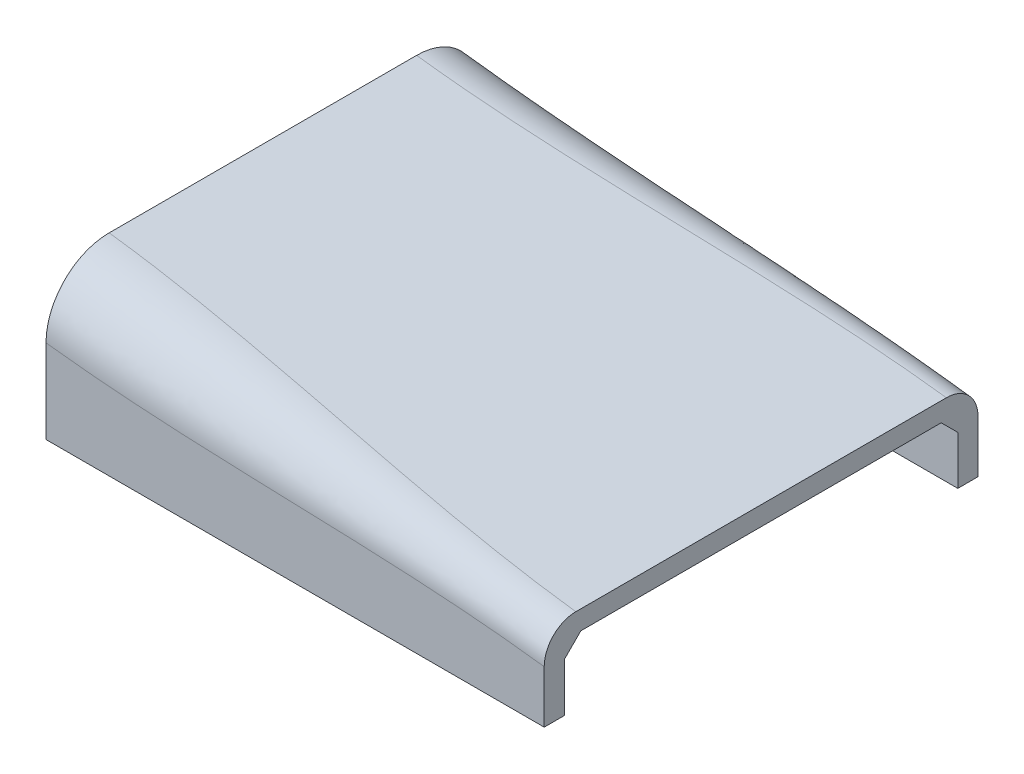
ISO-10303-21;
HEADER;
FILE_DESCRIPTION(('STEP AP214'),'2;1');
FILE_NAME('part.step','',(''),(''),'','','');
FILE_SCHEMA(('AUTOMOTIVE_DESIGN { 1 0 10303 214 1 1 1 1 }'));
ENDSEC;
DATA;
#1=APPLICATION_CONTEXT('core data for automotive mechanical design processes');
#2=APPLICATION_PROTOCOL_DEFINITION('international standard','automotive_design',2000,#1);
#3=PRODUCT_CONTEXT('',#1,'mechanical');
#4=PRODUCT('Part','Part','',(#3));
#5=PRODUCT_RELATED_PRODUCT_CATEGORY('part','',(#4));
#6=PRODUCT_DEFINITION_FORMATION('','',#4);
#7=PRODUCT_DEFINITION_CONTEXT('part definition',#1,'design');
#8=PRODUCT_DEFINITION('design','',#6,#7);
#9=PRODUCT_DEFINITION_SHAPE('','',#8);
#10=(LENGTH_UNIT() NAMED_UNIT(*) SI_UNIT(.MILLI.,.METRE.));
#11=(NAMED_UNIT(*) PLANE_ANGLE_UNIT() SI_UNIT($,.RADIAN.));
#12=(NAMED_UNIT(*) SI_UNIT($,.STERADIAN.) SOLID_ANGLE_UNIT());
#13=UNCERTAINTY_MEASURE_WITH_UNIT(LENGTH_MEASURE(1.E-05),#10,'distance_accuracy_value','');
#14=(GEOMETRIC_REPRESENTATION_CONTEXT(3) GLOBAL_UNCERTAINTY_ASSIGNED_CONTEXT((#13)) GLOBAL_UNIT_ASSIGNED_CONTEXT((#10,
#11,#12)) REPRESENTATION_CONTEXT('',''));
#15=CARTESIAN_POINT('',(0.,0.,0.));
#16=DIRECTION('',(0.,0.,1.));
#17=DIRECTION('',(1.,0.,0.));
#18=AXIS2_PLACEMENT_3D('',#15,#16,#17);
#19=CARTESIAN_POINT('',(0.,0.,261.62));
#20=DIRECTION('',(1.,0.,0.));
#21=DIRECTION('',(0.,0.,-1.));
#22=AXIS2_PLACEMENT_3D('',#19,#20,#21);
#23=PLANE('',#22);
#24=DIRECTION('',(0.,1.,0.));
#25=VECTOR('',#24,1.);
#26=CARTESIAN_POINT('',(0.,0.,249.5296));
#27=LINE('',#26,#25);
#28=CARTESIAN_POINT('',(0.,0.,249.5296));
#29=VERTEX_POINT('',#28);
#30=CARTESIAN_POINT('',(0.,29.2748351793856,249.5296));
#31=VERTEX_POINT('',#30);
#32=EDGE_CURVE('E176',#29,#31,#27,.T.);
#33=ORIENTED_EDGE('',*,*,#32,.F.);
#34=DIRECTION('',(0.,0.,-1.));
#35=VECTOR('',#34,1.);
#36=CARTESIAN_POINT('',(0.,0.,261.62));
#37=LINE('',#36,#35);
#38=CARTESIAN_POINT('',(0.,0.,261.62));
#39=VERTEX_POINT('',#38);
#40=EDGE_CURVE('E214',#39,#29,#37,.T.);
#41=ORIENTED_EDGE('',*,*,#40,.F.);
#42=DIRECTION('',(0.,-1.,0.));
#43=VECTOR('',#42,1.);
#44=CARTESIAN_POINT('',(0.,0.,261.62));
#45=LINE('',#44,#43);
#46=CARTESIAN_POINT('',(0.,50.5093577816487,261.62));
#47=VERTEX_POINT('',#46);
#48=EDGE_CURVE('E180',#47,#39,#45,.T.);
#49=ORIENTED_EDGE('',*,*,#48,.F.);
#50=CARTESIAN_POINT('',(0.,50.5093577816487,261.62));
#51=CARTESIAN_POINT('',(0.,51.2338549675014,261.620021684295));
#52=CARTESIAN_POINT('',(0.,51.9583483879421,261.599624383296));
#53=CARTESIAN_POINT('',(0.,53.405017554121,261.518160641832));
#54=CARTESIAN_POINT('',(0.,54.1271933879022,261.457095765116));
#55=CARTESIAN_POINT('',(0.,55.5669638965802,261.294466741535));
#56=CARTESIAN_POINT('',(0.,56.284558631203,261.192903123772));
#57=CARTESIAN_POINT('',(0.,57.7124950755533,260.949671154266));
#58=CARTESIAN_POINT('',(0.,58.4228406140335,260.808025243744));
#59=CARTESIAN_POINT('',(0.,59.8344788839958,260.485026201346));
#60=CARTESIAN_POINT('',(0.,60.5357717267324,260.303673557943));
#61=CARTESIAN_POINT('',(0.,61.5791148980711,260.00232622184));
#62=CARTESIAN_POINT('',(0.,61.9254584851736,259.896992394264));
#63=CARTESIAN_POINT('',(0.,62.6151222327006,259.676603558663));
#64=CARTESIAN_POINT('',(0.,62.9584416381653,259.56154619517));
#65=CARTESIAN_POINT('',(0.,64.3250333131327,259.082047980406));
#66=CARTESIAN_POINT('',(0.,65.3350786472589,258.679025524934));
#67=CARTESIAN_POINT('',(0.,67.3175076019533,257.789087703527));
#68=CARTESIAN_POINT('',(0.,68.2898914121236,257.302172760004));
#69=CARTESIAN_POINT('',(0.,69.5563144621561,256.599501051767));
#70=CARTESIAN_POINT('',(0.,69.8704473154572,256.419357720284));
#71=CARTESIAN_POINT('',(0.,70.493435895138,256.0503163317));
#72=CARTESIAN_POINT('',(0.,70.8022928587939,255.861420366901));
#73=CARTESIAN_POINT('',(0.,71.7207364445453,255.281715942071));
#74=CARTESIAN_POINT('',(0.,72.3221855375472,254.877896624369));
#75=CARTESIAN_POINT('',(0.,73.501222265985,254.036957677115));
#76=CARTESIAN_POINT('',(0.,74.0788100737197,253.599838288082));
#77=CARTESIAN_POINT('',(0.,75.4875994312902,252.469500976264));
#78=CARTESIAN_POINT('',(0.,76.3030565222708,251.756486180399));
#79=CARTESIAN_POINT('',(0.,77.870567652777,250.264002365215));
#80=CARTESIAN_POINT('',(0.,78.6226214393287,249.484533080773));
#81=CARTESIAN_POINT('',(0.,80.0580179406557,247.864396598736));
#82=CARTESIAN_POINT('',(0.,80.7413473759364,247.023717627588));
#83=CARTESIAN_POINT('',(0.,82.0340002638618,245.287295921897));
#84=CARTESIAN_POINT('',(0.,82.6433253422875,244.391554397659));
#85=CARTESIAN_POINT('',(0.,83.7793867264662,242.557907769889));
#86=CARTESIAN_POINT('',(0.,84.3066764533401,241.620345518291));
#87=CARTESIAN_POINT('',(0.,85.2799088058692,239.703822333519));
#88=CARTESIAN_POINT('',(0.,85.7258464238679,238.724858856443));
#89=CARTESIAN_POINT('',(0.,86.5327390326594,236.733224847864));
#90=CARTESIAN_POINT('',(0.,86.8937447436832,235.720574848078));
#91=CARTESIAN_POINT('',(0.,87.5283337626233,233.668418230422));
#92=CARTESIAN_POINT('',(0.,87.8019400573773,232.628918752078));
#93=CARTESIAN_POINT('',(0.,88.1752274167013,230.918031551378));
#94=CARTESIAN_POINT('',(0.,88.3018295459198,230.252390309494));
#95=CARTESIAN_POINT('',(0.,88.5191074509568,228.915281604994));
#96=CARTESIAN_POINT('',(0.,88.6097861814809,228.243814626189));
#97=CARTESIAN_POINT('',(0.,88.754825479018,226.898003092296));
#98=CARTESIAN_POINT('',(0.,88.8092404964376,226.223664388437));
#99=CARTESIAN_POINT('',(0.,88.8818411086118,224.872886597588));
#100=CARTESIAN_POINT('',(0.,88.900018493707,224.196447069412));
#101=CARTESIAN_POINT('',(0.,88.9,223.52));
#102=B_SPLINE_CURVE_WITH_KNOTS('',3,(#50,#51,#52,#53,#54,#55,#56,#57,#58,#59,#60,#61,#62,#63,
#64,#65,#66,#67,#68,#69,#70,#71,#72,#73,#74,#75,#76,#77,#78,#79,#80,#81,#82,#83,#84,#85,#86,#87,
#88,#89,#90,#91,#92,#93,#94,#95,#96,#97,#98,#99,#100,#101),.UNSPECIFIED.,.F.,.F.,(4,2,2,2,2,2,2,
2,2,2,2,2,2,2,2,2,2,2,2,2,2,2,2,2,2,4),(0.,2.17319841876267,4.34631327855721,6.51939974829448,
8.69127195231501,10.8631174393272,11.9490097830875,13.0351659360635,16.2934072809777,
19.5516322205639,20.6378889645533,21.7238873672266,23.8959191988091,26.0679353437322,
29.3134576848088,32.5589929746501,35.8051541939462,39.0512440863283,42.2743851960364,
45.4977246403848,48.7191342341981,51.9396958691884,53.9715440449321,56.0032250661097,
58.031848578687,60.0609316250404),.UNSPECIFIED.);
#103=CARTESIAN_POINT('',(0.,88.9,223.52));
#104=VERTEX_POINT('',#103);
#105=EDGE_CURVE('E232',#47,#104,#102,.T.);
#106=ORIENTED_EDGE('',*,*,#105,.T.);
#107=DIRECTION('',(0.,0.,-1.));
#108=VECTOR('',#107,1.);
#109=CARTESIAN_POINT('',(0.,88.9,261.62));
#110=LINE('',#109,#108);
#111=CARTESIAN_POINT('',(0.,88.9,38.1));
#112=VERTEX_POINT('',#111);
#113=EDGE_CURVE('E190',#104,#112,#110,.T.);
#114=ORIENTED_EDGE('',*,*,#113,.T.);
#115=CARTESIAN_POINT('',(0.,88.9,38.1));
#116=CARTESIAN_POINT('',(0.,88.9000237332035,37.3908185569623));
#117=CARTESIAN_POINT('',(0.,88.8800416192242,36.6816397971363));
#118=CARTESIAN_POINT('',(0.,88.8002387506326,35.2655722821444));
#119=CARTESIAN_POINT('',(0.,88.7404205363225,34.558683383845));
#120=CARTESIAN_POINT('',(0.,88.581120236481,33.1494047577195));
#121=CARTESIAN_POINT('',(0.,88.4816390255648,32.4470149310307));
#122=CARTESIAN_POINT('',(0.,88.2434660688437,31.0496201930839));
#123=CARTESIAN_POINT('',(0.,88.1048126301125,30.3546087519551));
#124=CARTESIAN_POINT('',(0.,87.7887126300176,28.9734698241933));
#125=CARTESIAN_POINT('',(0.,87.6112663421349,28.2873422749669));
#126=CARTESIAN_POINT('',(0.,87.2181663681753,26.9261254482831));
#127=CARTESIAN_POINT('',(0.,87.0025128802907,26.2510361135868));
#128=CARTESIAN_POINT('',(0.,86.5335240818755,24.9134870786321));
#129=CARTESIAN_POINT('',(0.,86.2801596280114,24.251037597249));
#130=CARTESIAN_POINT('',(0.,85.736700672084,22.9413714325287));
#131=CARTESIAN_POINT('',(0.,85.4466057020306,22.2941549434024));
#132=CARTESIAN_POINT('',(0.,84.830635914236,21.016979273597));
#133=CARTESIAN_POINT('',(0.,84.5047611443375,20.3870200698439));
#134=CARTESIAN_POINT('',(0.,83.8183339939151,19.1463855855002));
#135=CARTESIAN_POINT('',(0.,83.4577855887443,18.535708104887));
#136=CARTESIAN_POINT('',(0.,82.7031378998175,17.3354367013278));
#137=CARTESIAN_POINT('',(0.,82.3090386735818,16.7458427422382));
#138=CARTESIAN_POINT('',(0.,81.4885974787508,15.5895879303813));
#139=CARTESIAN_POINT('',(0.,81.062255551151,15.0229270484569));
#140=CARTESIAN_POINT('',(0.,79.9545813932788,13.6330990528378));
#141=CARTESIAN_POINT('',(0.,79.2535411269209,12.8255093116065));
#142=CARTESIAN_POINT('',(0.,77.7863565448944,11.2719446191966));
#143=CARTESIAN_POINT('',(0.,77.020211742435,10.5259701288012));
#144=CARTESIAN_POINT('',(0.,75.4280794487412,9.10049271826823));
#145=CARTESIAN_POINT('',(0.,74.602079473983,8.42100373434533));
#146=CARTESIAN_POINT('',(0.,72.8962865894875,7.13332371544002));
#147=CARTESIAN_POINT('',(0.,72.0164941775879,6.5251320207682));
#148=CARTESIAN_POINT('',(0.,70.2023427054651,5.37973061542341));
#149=CARTESIAN_POINT('',(0.,69.267615167588,4.84310446109733));
#150=CARTESIAN_POINT('',(0.,67.3564226623036,3.8500320396117));
#151=CARTESIAN_POINT('',(0.,66.379955123345,3.39359072142104));
#152=CARTESIAN_POINT('',(0.,64.3926831270967,2.56419703589597));
#153=CARTESIAN_POINT('',(0.,63.3818928731475,2.19121060693241));
#154=CARTESIAN_POINT('',(0.,61.3328126860295,1.53106451350714));
#155=CARTESIAN_POINT('',(0.,60.294528840952,1.24388601819609));
#156=CARTESIAN_POINT('',(0.,58.5302519546596,0.834385523766727));
#157=CARTESIAN_POINT('',(0.,57.8095920660374,0.688661958516971));
#158=CARTESIAN_POINT('',(0.,56.3611634159637,0.438554696652073));
#159=CARTESIAN_POINT('',(0.,55.6333956599314,0.334165237614919));
#160=CARTESIAN_POINT('',(0.,54.4172478158907,0.194985811048258));
#161=CARTESIAN_POINT('',(0.,53.9301594022672,0.14859492246495));
#162=CARTESIAN_POINT('',(0.,52.9545149839559,0.0743347082214391));
#163=CARTESIAN_POINT('',(0.,52.465958852614,0.0464670299628804));
#164=CARTESIAN_POINT('',(0.,51.488052292353,0.00929524580367477));
#165=CARTESIAN_POINT('',(0.,50.9987017355363,-5.49510605874235E-06));
#166=CARTESIAN_POINT('',(0.,50.5093577816487,0.));
#167=B_SPLINE_CURVE_WITH_KNOTS('',3,(#115,#116,#117,#118,#119,#120,#121,#122,#123,#124,#125,
#126,#127,#128,#129,#130,#131,#132,#133,#134,#135,#136,#137,#138,#139,#140,#141,#142,#143,#144,
#145,#146,#147,#148,#149,#150,#151,#152,#153,#154,#155,#156,#157,#158,#159,#160,#161,#162,#163,
#164,#165,#166),.UNSPECIFIED.,.F.,.F.,(4,2,2,2,2,2,2,2,2,2,2,2,2,2,2,2,2,2,2,2,2,2,2,2,2,4),(0.,
2.12725894675263,4.25438225364198,6.38145865757526,8.50646212109456,10.6314506042961,
12.7564280648583,14.8830563343877,17.0097117023949,19.1363642267952,21.262773219235,
23.3891785661865,25.5155812095299,28.7198454629637,31.9241336769881,35.1290921184651,
38.3340209032178,41.563664946971,44.7935082527984,48.0220309023648,51.2498445201604,
53.4545043655155,55.6588567491087,57.1264171941195,58.5941081423244,60.0620650643086),.UNSPECIFIED.);
#168=CARTESIAN_POINT('',(0.,50.5093577816487,0.));
#169=VERTEX_POINT('',#168);
#170=EDGE_CURVE('E243',#112,#169,#167,.T.);
#171=ORIENTED_EDGE('',*,*,#170,.T.);
#172=DIRECTION('',(0.,-1.,0.));
#173=VECTOR('',#172,1.);
#174=CARTESIAN_POINT('',(0.,0.,0.));
#175=LINE('',#174,#173);
#176=CARTESIAN_POINT('',(0.,0.,0.));
#177=VERTEX_POINT('',#176);
#178=EDGE_CURVE('E179',#169,#177,#175,.T.);
#179=ORIENTED_EDGE('',*,*,#178,.T.);
#180=CARTESIAN_POINT('',(0.,0.,12.192));
#181=VERTEX_POINT('',#180);
#182=EDGE_CURVE('E213',#181,#177,#37,.T.);
#183=ORIENTED_EDGE('',*,*,#182,.F.);
#184=DIRECTION('',(0.,-1.,0.));
#185=VECTOR('',#184,1.);
#186=CARTESIAN_POINT('',(0.,0.,12.192));
#187=LINE('',#186,#185);
#188=CARTESIAN_POINT('',(0.,29.2748351793856,12.192));
#189=VERTEX_POINT('',#188);
#190=EDGE_CURVE('E170',#189,#181,#187,.T.);
#191=ORIENTED_EDGE('',*,*,#190,.F.);
#192=DIRECTION('',(0.,-0.707106781186548,-0.707106781186548));
#193=VECTOR('',#192,1.);
#194=CARTESIAN_POINT('',(0.,139.351417589693,122.268582410307));
#195=LINE('',#194,#193);
#196=CARTESIAN_POINT('',(0.,39.2748351793856,22.192));
#197=VERTEX_POINT('',#196);
#198=EDGE_CURVE('E166',#197,#189,#195,.T.);
#199=ORIENTED_EDGE('',*,*,#198,.F.);
#200=DIRECTION('',(0.,0.,-1.));
#201=VECTOR('',#200,1.);
#202=CARTESIAN_POINT('',(0.,39.2748351793856,261.62));
#203=LINE('',#202,#201);
#204=CARTESIAN_POINT('',(0.,39.2748351793856,239.5296));
#205=VERTEX_POINT('',#204);
#206=EDGE_CURVE('E151',#205,#197,#203,.T.);
#207=ORIENTED_EDGE('',*,*,#206,.F.);
#208=DIRECTION('',(0.,0.707106781186547,-0.707106781186548));
#209=VECTOR('',#208,1.);
#210=CARTESIAN_POINT('',(0.,8.59221758969282,270.212217589693));
#211=LINE('',#210,#209);
#212=EDGE_CURVE('E143',#31,#205,#211,.T.);
#213=ORIENTED_EDGE('',*,*,#212,.F.);
#214=EDGE_LOOP('',(#33,#41,#49,#106,#114,#171,#179,#183,#191,#199,#207,#213));
#215=FACE_BOUND('',#214,.T.);
#216=ADVANCED_FACE('F49',(#215),#23,.F.);
#217=CARTESIAN_POINT('',(0.,0.,261.62));
#218=DIRECTION('',(0.,1.,0.));
#219=DIRECTION('',(0.,0.,1.));
#220=AXIS2_PLACEMENT_3D('',#217,#218,#219);
#221=PLANE('',#220);
#222=DIRECTION('',(-1.,0.,0.));
#223=VECTOR('',#222,1.);
#224=CARTESIAN_POINT('',(314.452,0.,249.5296));
#225=LINE('',#224,#223);
#226=CARTESIAN_POINT('',(300.482,0.,249.5296));
#227=VERTEX_POINT('',#226);
#228=EDGE_CURVE('E152',#227,#29,#225,.T.);
#229=ORIENTED_EDGE('',*,*,#228,.F.);
#230=DIRECTION('',(0.,0.,-1.));
#231=VECTOR('',#230,1.);
#232=CARTESIAN_POINT('',(300.482,0.,261.62));
#233=LINE('',#232,#231);
#234=CARTESIAN_POINT('',(300.482,0.,261.62));
#235=VERTEX_POINT('',#234);
#236=EDGE_CURVE('E209',#235,#227,#233,.T.);
#237=ORIENTED_EDGE('',*,*,#236,.F.);
#238=DIRECTION('',(1.,0.,0.));
#239=VECTOR('',#238,1.);
#240=CARTESIAN_POINT('',(0.,0.,261.62));
#241=LINE('',#240,#239);
#242=EDGE_CURVE('E183',#39,#235,#241,.T.);
#243=ORIENTED_EDGE('',*,*,#242,.F.);
#244=ORIENTED_EDGE('',*,*,#40,.T.);
#245=EDGE_LOOP('',(#229,#237,#243,#244));
#246=FACE_BOUND('',#245,.T.);
#247=ADVANCED_FACE('F252',(#246),#221,.F.);
#248=DIRECTION('',(-1.,0.,0.));
#249=VECTOR('',#248,1.);
#250=CARTESIAN_POINT('',(314.452,0.,12.192));
#251=LINE('',#250,#249);
#252=CARTESIAN_POINT('',(300.482,0.,12.192));
#253=VERTEX_POINT('',#252);
#254=EDGE_CURVE('E438',#253,#181,#251,.T.);
#255=ORIENTED_EDGE('',*,*,#254,.T.);
#256=ORIENTED_EDGE('',*,*,#182,.T.);
#257=DIRECTION('',(1.,0.,0.));
#258=VECTOR('',#257,1.);
#259=CARTESIAN_POINT('',(0.,0.,0.));
#260=LINE('',#259,#258);
#261=CARTESIAN_POINT('',(300.482,0.,0.));
#262=VERTEX_POINT('',#261);
#263=EDGE_CURVE('E194',#177,#262,#260,.T.);
#264=ORIENTED_EDGE('',*,*,#263,.T.);
#265=EDGE_CURVE('E208',#253,#262,#233,.T.);
#266=ORIENTED_EDGE('',*,*,#265,.F.);
#267=EDGE_LOOP('',(#255,#256,#264,#266));
#268=FACE_BOUND('',#267,.T.);
#269=ADVANCED_FACE('F293',(#268),#221,.F.);
#270=CARTESIAN_POINT('',(300.482,0.,261.62));
#271=DIRECTION('',(-1.,0.,0.));
#272=DIRECTION('',(0.,0.,1.));
#273=AXIS2_PLACEMENT_3D('',#270,#271,#272);
#274=PLANE('',#273);
#275=DIRECTION('',(0.,-1.,0.));
#276=VECTOR('',#275,1.);
#277=CARTESIAN_POINT('',(300.482,0.,249.5296));
#278=LINE('',#277,#276);
#279=CARTESIAN_POINT('',(300.482,29.2748351793856,249.5296));
#280=VERTEX_POINT('',#279);
#281=EDGE_CURVE('E11',#280,#227,#278,.T.);
#282=ORIENTED_EDGE('',*,*,#281,.F.);
#283=DIRECTION('',(0.,-0.707106781186547,0.707106781186548));
#284=VECTOR('',#283,1.);
#285=CARTESIAN_POINT('',(300.482,8.59221758969282,270.212217589693));
#286=LINE('',#285,#284);
#287=CARTESIAN_POINT('',(300.482,39.2748351793856,239.5296));
#288=VERTEX_POINT('',#287);
#289=EDGE_CURVE('E456',#288,#280,#286,.T.);
#290=ORIENTED_EDGE('',*,*,#289,.F.);
#291=DIRECTION('',(0.,0.,1.));
#292=VECTOR('',#291,1.);
#293=CARTESIAN_POINT('',(300.482,39.2748351793856,261.62));
#294=LINE('',#293,#292);
#295=CARTESIAN_POINT('',(300.482,39.2748351793856,22.192));
#296=VERTEX_POINT('',#295);
#297=EDGE_CURVE('E159',#296,#288,#294,.T.);
#298=ORIENTED_EDGE('',*,*,#297,.F.);
#299=DIRECTION('',(0.,0.707106781186548,0.707106781186548));
#300=VECTOR('',#299,1.);
#301=CARTESIAN_POINT('',(300.482,139.351417589693,122.268582410307));
#302=LINE('',#301,#300);
#303=CARTESIAN_POINT('',(300.482,29.2748351793856,12.192));
#304=VERTEX_POINT('',#303);
#305=EDGE_CURVE('E459',#304,#296,#302,.T.);
#306=ORIENTED_EDGE('',*,*,#305,.F.);
#307=DIRECTION('',(0.,1.,0.));
#308=VECTOR('',#307,1.);
#309=CARTESIAN_POINT('',(300.482,0.,12.192));
#310=LINE('',#309,#308);
#311=EDGE_CURVE('E62',#253,#304,#310,.T.);
#312=ORIENTED_EDGE('',*,*,#311,.F.);
#313=ORIENTED_EDGE('',*,*,#265,.T.);
#314=DIRECTION('',(0.,1.,0.));
#315=VECTOR('',#314,1.);
#316=CARTESIAN_POINT('',(300.482,0.,0.));
#317=LINE('',#316,#315);
#318=CARTESIAN_POINT('',(300.482,31.5922364821457,0.));
#319=VERTEX_POINT('',#318);
#320=EDGE_CURVE('E184',#262,#319,#317,.T.);
#321=ORIENTED_EDGE('',*,*,#320,.T.);
#322=CARTESIAN_POINT('',(300.482,31.5922364821457,0.));
#323=CARTESIAN_POINT('',(300.482,31.954409117299,-1.08906948531902E-05));
#324=CARTESIAN_POINT('',(300.482,32.316580676166,0.010164400643445));
#325=CARTESIAN_POINT('',(300.482,33.0397720518617,0.0508083251498978));
#326=CARTESIAN_POINT('',(300.482,33.4007919044421,0.0812763221027689));
#327=CARTESIAN_POINT('',(300.482,34.1205491203961,0.1624261927709));
#328=CARTESIAN_POINT('',(300.482,34.4792865091514,0.213107841304666));
#329=CARTESIAN_POINT('',(300.482,35.1931631035561,0.334496964644925));
#330=CARTESIAN_POINT('',(300.482,35.5483040880604,0.405193982415675));
#331=CARTESIAN_POINT('',(300.482,36.2540573503136,0.56641459742345));
#332=CARTESIAN_POINT('',(300.482,36.6046696910207,0.656937918716249));
#333=CARTESIAN_POINT('',(300.482,37.3002361376109,0.857528089594006));
#334=CARTESIAN_POINT('',(300.482,37.6451902760038,0.967594826847107));
#335=CARTESIAN_POINT('',(300.482,38.4994194689579,1.26688462253664));
#336=CARTESIAN_POINT('',(300.482,39.0045229758761,1.46815314859513));
#337=CARTESIAN_POINT('',(300.482,39.996011703211,1.91266886502859));
#338=CARTESIAN_POINT('',(300.482,40.4823945259945,2.15592141073041));
#339=CARTESIAN_POINT('',(300.482,41.1950922958557,2.55090625781202));
#340=CARTESIAN_POINT('',(300.482,41.4298534471124,2.68759088985279));
#341=CARTESIAN_POINT('',(300.482,41.8933113177583,2.97073740526871));
#342=CARTESIAN_POINT('',(300.482,42.1220097266016,3.11719652398882));
#343=CARTESIAN_POINT('',(300.482,42.7985211548653,3.57095534844908));
#344=CARTESIAN_POINT('',(300.482,43.2367943858733,3.8926609160772));
#345=CARTESIAN_POINT('',(300.482,44.0828651283246,4.57083784471547));
#346=CARTESIAN_POINT('',(300.482,44.4907671282743,4.92717926045942));
#347=CARTESIAN_POINT('',(300.482,45.2749293790284,5.67315869252944));
#348=CARTESIAN_POINT('',(300.482,45.6511894985601,6.06279684698032));
#349=CARTESIAN_POINT('',(300.482,46.3693357821011,6.87269143512568));
#350=CARTESIAN_POINT('',(300.482,46.71121519402,7.29295385533523));
#351=CARTESIAN_POINT('',(300.482,47.3579687314923,8.16103978064142));
#352=CARTESIAN_POINT('',(300.482,47.6628436761,8.60886267538577));
#353=CARTESIAN_POINT('',(300.482,48.2311989917099,9.52547200452256));
#354=CARTESIAN_POINT('',(300.482,48.4949683931787,9.99407923044769));
#355=CARTESIAN_POINT('',(300.482,48.9818503110772,10.9519939887277));
#356=CARTESIAN_POINT('',(300.482,49.2049603429801,11.4413027838207));
#357=CARTESIAN_POINT('',(300.482,49.6087111991708,12.4368186609585));
#358=CARTESIAN_POINT('',(300.482,49.7893772990699,12.9430154799124));
#359=CARTESIAN_POINT('',(300.482,50.1070035453185,13.9687276062505));
#360=CARTESIAN_POINT('',(300.482,50.2439751377144,14.4882393871109));
#361=CARTESIAN_POINT('',(300.482,50.5035112444139,15.6756616965805));
#362=CARTESIAN_POINT('',(300.482,50.6127415044361,16.3465642180439));
#363=CARTESIAN_POINT('',(300.482,50.7219604931707,17.3579429143746));
#364=CARTESIAN_POINT('',(300.482,50.7492623911276,17.6957054251948));
#365=CARTESIAN_POINT('',(300.482,50.785684760305,18.372286038639));
#366=CARTESIAN_POINT('',(300.482,50.7948011176608,18.7111043627472));
#367=CARTESIAN_POINT('',(300.482,50.7948035716802,19.05));
#368=B_SPLINE_CURVE_WITH_KNOTS('',3,(#322,#323,#324,#325,#326,#327,#328,#329,#330,#331,#332,
#333,#334,#335,#336,#337,#338,#339,#340,#341,#342,#343,#344,#345,#346,#347,#348,#349,#350,#351,
#352,#353,#354,#355,#356,#357,#358,#359,#360,#361,#362,#363,#364,#365,#366,#367),.UNSPECIFIED.,
.F.,.F.,(4,2,2,2,2,2,2,2,2,2,2,2,2,2,2,2,2,2,2,2,2,2,4),(0.,1.08637340515084,2.17271275201276,
3.2590399973163,4.34480073465611,5.43054636124335,6.51628574737219,8.14545610313911,
9.77483442366469,10.5895809836862,11.4040980662505,13.0329817663689,14.6559742939839,
16.2789735545829,17.9022909390546,19.5255723865841,21.1368677099936,22.7482614600368,
24.3586931693423,25.9687026690253,28.003465249707,29.0196454786372,30.036055557978),.UNSPECIFIED.);
#369=CARTESIAN_POINT('',(300.482,50.7948035716802,19.05));
#370=VERTEX_POINT('',#369);
#371=EDGE_CURVE('E272',#319,#370,#368,.T.);
#372=ORIENTED_EDGE('',*,*,#371,.T.);
#373=DIRECTION('',(0.,0.,-1.));
#374=VECTOR('',#373,1.);
#375=CARTESIAN_POINT('',(300.482,50.7948035716802,261.62));
#376=LINE('',#375,#374);
#377=CARTESIAN_POINT('',(300.482,50.7948035716802,242.57));
#378=VERTEX_POINT('',#377);
#379=EDGE_CURVE('E204',#378,#370,#376,.T.);
#380=ORIENTED_EDGE('',*,*,#379,.F.);
#381=CARTESIAN_POINT('',(300.482,50.7948035716802,242.57));
#382=CARTESIAN_POINT('',(300.482,50.7948154596895,242.925143363583));
#383=CARTESIAN_POINT('',(300.482,50.7847932340893,243.280285221188));
#384=CARTESIAN_POINT('',(300.482,50.7447674429722,243.989418730854));
#385=CARTESIAN_POINT('',(300.482,50.7147651467961,244.343410454548));
#386=CARTESIAN_POINT('',(300.482,50.6348669568373,245.049134177401));
#387=CARTESIAN_POINT('',(300.482,50.5849714989565,245.400866225903));
#388=CARTESIAN_POINT('',(300.482,50.4655154406574,246.10062064797));
#389=CARTESIAN_POINT('',(300.482,50.3959740403474,246.448646300915));
#390=CARTESIAN_POINT('',(300.482,50.2374333762479,247.140239434579));
#391=CARTESIAN_POINT('',(300.482,50.1484342551718,247.483806947978));
#392=CARTESIAN_POINT('',(300.482,49.9512824674219,248.165379523791));
#393=CARTESIAN_POINT('',(300.482,49.8431299076134,248.503384617228));
#394=CARTESIAN_POINT('',(300.482,49.5491746872008,249.340308630786));
#395=CARTESIAN_POINT('',(300.482,49.3515930212756,249.83513731473));
#396=CARTESIAN_POINT('',(300.482,48.9154803258906,250.806508942461));
#397=CARTESIAN_POINT('',(300.482,48.6769437432811,251.283049395778));
#398=CARTESIAN_POINT('',(300.482,48.2898459921374,251.981469557706));
#399=CARTESIAN_POINT('',(300.482,48.1559181937601,252.211564042468));
#400=CARTESIAN_POINT('',(300.482,47.8785666267225,252.665866712635));
#401=CARTESIAN_POINT('',(300.482,47.7351455442905,252.890076538303));
#402=CARTESIAN_POINT('',(300.482,47.2909345846786,253.553429042461));
#403=CARTESIAN_POINT('',(300.482,46.9761758912589,253.983332806946));
#404=CARTESIAN_POINT('',(300.482,46.3106951792515,254.816706887371));
#405=CARTESIAN_POINT('',(300.482,45.9598516883125,255.220079893729));
#406=CARTESIAN_POINT('',(300.482,45.2256061154745,255.996043489525));
#407=CARTESIAN_POINT('',(300.482,44.8422038211508,256.368633878094));
#408=CARTESIAN_POINT('',(300.482,44.0455237512503,257.080534746901));
#409=CARTESIAN_POINT('',(300.482,43.6322398927192,257.419838417681));
#410=CARTESIAN_POINT('',(300.482,42.7788108168102,258.062778866861));
#411=CARTESIAN_POINT('',(300.482,42.3386658437671,258.36641596962));
#412=CARTESIAN_POINT('',(300.482,41.4311511732525,258.93816835975));
#413=CARTESIAN_POINT('',(300.482,40.9635985143333,259.20599325158));
#414=CARTESIAN_POINT('',(300.482,40.0076719003143,259.701551464929));
#415=CARTESIAN_POINT('',(300.482,39.5192966620847,259.929282311321));
#416=CARTESIAN_POINT('',(300.482,38.5254229448482,260.343012402643));
#417=CARTESIAN_POINT('',(300.482,38.0199314091567,260.529028341447));
#418=CARTESIAN_POINT('',(300.482,36.9952500358553,260.858172863366));
#419=CARTESIAN_POINT('',(300.482,36.476063234861,261.001310868157));
#420=CARTESIAN_POINT('',(300.482,35.5945828213401,261.205176914468));
#421=CARTESIAN_POINT('',(300.482,35.2349542316488,261.277633897014));
#422=CARTESIAN_POINT('',(300.482,34.5121648874769,261.401989496324));
#423=CARTESIAN_POINT('',(300.482,34.1490043856868,261.453889572905));
#424=CARTESIAN_POINT('',(300.482,33.4208664221012,261.536905259228));
#425=CARTESIAN_POINT('',(300.482,33.0558924500017,261.568051552879));
#426=CARTESIAN_POINT('',(300.482,32.3246925142841,261.609606432922));
#427=CARTESIAN_POINT('',(300.482,31.9584663142414,261.620010858792));
#428=CARTESIAN_POINT('',(300.482,31.5922364821457,261.62));
#429=B_SPLINE_CURVE_WITH_KNOTS('',3,(#381,#382,#383,#384,#385,#386,#387,#388,#389,#390,#391,
#392,#393,#394,#395,#396,#397,#398,#399,#400,#401,#402,#403,#404,#405,#406,#407,#408,#409,#410,
#411,#412,#413,#414,#415,#416,#417,#418,#419,#420,#421,#422,#423,#424,#425,#426,#427,#428),
.UNSPECIFIED.,.F.,.F.,(4,2,2,2,2,2,2,2,2,2,2,2,2,2,2,2,2,2,2,2,2,2,2,4),(0.,1.06528641628581,
2.13050516101123,3.19570056578503,4.25985852818476,5.32400868573827,6.38815290613237,
7.98464477111961,9.58135327847381,10.379848009411,11.1781177555356,12.7745271077634,
14.3764981964405,15.9784797377221,17.5807883156664,19.1830823208197,20.797669134332,
22.4123555861801,24.0263946995169,25.640078895447,26.740101657721,27.8400462895807,
28.9383610531657,30.0368961007772),.UNSPECIFIED.);
#430=CARTESIAN_POINT('',(300.482,31.5922364821457,261.62));
#431=VERTEX_POINT('',#430);
#432=EDGE_CURVE('E77',#378,#431,#429,.T.);
#433=ORIENTED_EDGE('',*,*,#432,.T.);
#434=DIRECTION('',(0.,1.,0.));
#435=VECTOR('',#434,1.);
#436=CARTESIAN_POINT('',(300.482,0.,261.62));
#437=LINE('',#436,#435);
#438=EDGE_CURVE('E187',#235,#431,#437,.T.);
#439=ORIENTED_EDGE('',*,*,#438,.F.);
#440=ORIENTED_EDGE('',*,*,#236,.T.);
#441=EDGE_LOOP('',(#282,#290,#298,#306,#312,#313,#321,#372,#380,#433,#439,#440));
#442=FACE_BOUND('',#441,.T.);
#443=ADVANCED_FACE('F288',(#442),#274,.F.);
#444=CARTESIAN_POINT('',(0.,88.9,261.62));
#445=DIRECTION('',(-0.125806022646148,-0.992054859705831,0.));
#446=DIRECTION('',(0.992054859705831,-0.125806022646148,0.));
#447=AXIS2_PLACEMENT_3D('',#444,#445,#446);
#448=PLANE('',#447);
#449=ORIENTED_EDGE('',*,*,#379,.T.);
#450=CARTESIAN_POINT('',(908.63581419422,-26.3273553213741,19.05));
#451=CARTESIAN_POINT('',(716.732811039949,-1.99144957534617,19.05));
#452=CARTESIAN_POINT('',(524.829807885679,22.3444561706818,19.05));
#453=CARTESIAN_POINT('',(332.926804731409,46.6803619167098,19.05));
#454=CARTESIAN_POINT('',(322.111869820939,48.0518424683666,19.05));
#455=CARTESIAN_POINT('',(311.29693491047,49.4233230200234,19.05));
#456=CARTESIAN_POINT('',(300.482,50.7948035716802,19.05));
#457=CARTESIAN_POINT('',(200.321333333334,63.4965357144534,19.05));
#458=CARTESIAN_POINT('',(100.160666666666,76.1982678572269,38.1));
#459=CARTESIAN_POINT('',(0.,88.9,38.1));
#460=CARTESIAN_POINT('',(-10.0160666666671,90.1701732142774,38.1));
#461=CARTESIAN_POINT('',(-20.0321333333341,91.4403464285547,38.1));
#462=CARTESIAN_POINT('',(-30.0482000000011,92.7105196428321,38.1));
#463=CARTESIAN_POINT('',(-221.951203154273,117.04642538886,38.1));
#464=CARTESIAN_POINT('',(-413.854206308544,141.382331134888,38.1));
#465=CARTESIAN_POINT('',(-605.757209462816,165.718236880916,38.1));
#466=(BOUNDED_CURVE() B_SPLINE_CURVE(3,(#450,#451,#452,#453,#454,#455,#456,#457,#458,#459,#460,
#461,#462,#463,#464,#465),.UNSPECIFIED.,.F.,.F.) B_SPLINE_CURVE_WITH_KNOTS((4,3,3,3,3,4),
(-1.58608444647263,0.,0.0893857822397923,0.917216889294524,1.,2.58608444647262),
.UNSPECIFIED.) CURVE() GEOMETRIC_REPRESENTATION_ITEM() RATIONAL_B_SPLINE_CURVE((1.,1.,1.,1.,1.,
1.,1.,1.,1.,1.,1.,1.,1.,1.,1.,1.)) REPRESENTATION_ITEM(''));
#467=EDGE_CURVE('E223',#370,#112,#466,.T.);
#468=ORIENTED_EDGE('',*,*,#467,.T.);
#469=ORIENTED_EDGE('',*,*,#113,.F.);
#470=CARTESIAN_POINT('',(908.635814194219,-26.3273553213741,242.570000000001));
#471=CARTESIAN_POINT('',(716.732811039949,-1.99144957534613,242.57));
#472=CARTESIAN_POINT('',(524.829807885679,22.3444561706818,242.57));
#473=CARTESIAN_POINT('',(332.926804731409,46.6803619167098,242.57));
#474=CARTESIAN_POINT('',(322.111869820939,48.0518424683666,242.57));
#475=CARTESIAN_POINT('',(311.29693491047,49.4233230200234,242.57));
#476=CARTESIAN_POINT('',(300.482,50.7948035716802,242.57));
#477=CARTESIAN_POINT('',(200.321333333334,63.4965357144534,242.57));
#478=CARTESIAN_POINT('',(100.160666666667,76.1982678572269,223.52));
#479=CARTESIAN_POINT('',(0.,88.9,223.52));
#480=CARTESIAN_POINT('',(-10.016066666667,90.1701732142774,223.52));
#481=CARTESIAN_POINT('',(-20.032133333334,91.4403464285547,223.52));
#482=CARTESIAN_POINT('',(-30.048200000001,92.7105196428321,223.52));
#483=CARTESIAN_POINT('',(-221.951203154272,117.04642538886,223.52));
#484=CARTESIAN_POINT('',(-413.854206308544,141.382331134888,223.520000000001));
#485=CARTESIAN_POINT('',(-605.757209462815,165.718236880915,223.520000000001));
#486=(BOUNDED_CURVE() B_SPLINE_CURVE(3,(#470,#471,#472,#473,#474,#475,#476,#477,#478,#479,#480,
#481,#482,#483,#484,#485),.UNSPECIFIED.,.F.,.F.) B_SPLINE_CURVE_WITH_KNOTS((4,3,3,3,3,4),
(-1.58608444647262,0.,0.0893857822397923,0.917216889294523,1.,2.58608444647262),
.UNSPECIFIED.) CURVE() GEOMETRIC_REPRESENTATION_ITEM() RATIONAL_B_SPLINE_CURVE((1.,1.,1.,1.,1.,
1.,1.,1.,1.,1.,1.,1.,1.,1.,1.,1.)) REPRESENTATION_ITEM(''));
#487=EDGE_CURVE('E218',#104,#378,#486,.F.);
#488=ORIENTED_EDGE('',*,*,#487,.T.);
#489=EDGE_LOOP('',(#449,#468,#469,#488));
#490=FACE_BOUND('',#489,.T.);
#491=ADVANCED_FACE('F292',(#490),#448,.F.);
#492=CARTESIAN_POINT('',(0.,0.,261.62));
#493=DIRECTION('',(0.,0.,-1.));
#494=DIRECTION('',(-1.,0.,0.));
#495=AXIS2_PLACEMENT_3D('',#492,#493,#494);
#496=PLANE('',#495);
#497=ORIENTED_EDGE('',*,*,#438,.T.);
#498=CARTESIAN_POINT('',(906.23920946281,-45.2260003987702,261.620000000001));
#499=CARTESIAN_POINT('',(714.33620630854,-20.8900946527422,261.62));
#500=CARTESIAN_POINT('',(522.43320315427,3.44581109328572,261.62));
#501=CARTESIAN_POINT('',(330.5302,27.7817168393137,261.62));
#502=CARTESIAN_POINT('',(319.71526508953,29.1531973909705,261.62));
#503=CARTESIAN_POINT('',(308.900330179061,30.5246779426273,261.62));
#504=CARTESIAN_POINT('',(298.085395268591,31.8961584942841,261.62));
#505=CARTESIAN_POINT('',(197.924728601925,44.5978906370573,261.62));
#506=CARTESIAN_POINT('',(95.3674572038483,38.4009777024347,261.62));
#507=CARTESIAN_POINT('',(-4.79320946281822,51.1027098452078,261.62));
#508=CARTESIAN_POINT('',(-14.8092761294853,52.3728830594852,261.62));
#509=CARTESIAN_POINT('',(-24.8253427961523,53.6430562737626,261.62));
#510=CARTESIAN_POINT('',(-34.8414094628194,54.9132294880399,261.62));
#511=CARTESIAN_POINT('',(-226.744412617091,79.2491352340677,261.62));
#512=CARTESIAN_POINT('',(-418.647415771362,103.585040980096,261.620000000001));
#513=CARTESIAN_POINT('',(-610.550418925634,127.920946726123,261.620000000001));
#514=(BOUNDED_CURVE() B_SPLINE_CURVE(3,(#498,#499,#500,#501,#502,#503,#504,#505,#506,#507,#508,
#509,#510,#511,#512,#513),.UNSPECIFIED.,.F.,.F.) B_SPLINE_CURVE_WITH_KNOTS((4,3,3,3,3,4),
(-1.58608444647262,0.,0.0893857822397923,0.917216889294523,1.,2.58608444647262),
.UNSPECIFIED.) CURVE() GEOMETRIC_REPRESENTATION_ITEM() RATIONAL_B_SPLINE_CURVE((1.,1.,1.,1.,1.,
1.,1.,1.,1.,1.,1.,1.,1.,1.,1.,1.)) REPRESENTATION_ITEM(''));
#515=EDGE_CURVE('E280',#431,#47,#514,.T.);
#516=ORIENTED_EDGE('',*,*,#515,.T.);
#517=ORIENTED_EDGE('',*,*,#48,.T.);
#518=ORIENTED_EDGE('',*,*,#242,.T.);
#519=EDGE_LOOP('',(#497,#516,#517,#518));
#520=FACE_BOUND('',#519,.T.);
#521=ADVANCED_FACE('F297',(#520),#496,.F.);
#522=CARTESIAN_POINT('',(0.,0.,0.));
#523=DIRECTION('',(0.,0.,-1.));
#524=DIRECTION('',(-1.,0.,0.));
#525=AXIS2_PLACEMENT_3D('',#522,#523,#524);
#526=PLANE('',#525);
#527=ORIENTED_EDGE('',*,*,#178,.F.);
#528=CARTESIAN_POINT('',(906.23920946281,-45.2260003987702,0.));
#529=CARTESIAN_POINT('',(714.33620630854,-20.8900946527423,0.));
#530=CARTESIAN_POINT('',(522.43320315427,3.4458110932857,0.));
#531=CARTESIAN_POINT('',(330.5302,27.7817168393137,0.));
#532=CARTESIAN_POINT('',(319.71526508953,29.1531973909705,0.));
#533=CARTESIAN_POINT('',(308.900330179061,30.5246779426273,0.));
#534=CARTESIAN_POINT('',(298.085395268591,31.8961584942841,0.));
#535=CARTESIAN_POINT('',(197.924728601925,44.5978906370573,0.));
#536=CARTESIAN_POINT('',(95.3674572038482,38.4009777024347,0.));
#537=CARTESIAN_POINT('',(-4.79320946281833,51.1027098452078,0.));
#538=CARTESIAN_POINT('',(-14.8092761294854,52.3728830594852,0.));
#539=CARTESIAN_POINT('',(-24.8253427961524,53.6430562737626,0.));
#540=CARTESIAN_POINT('',(-34.8414094628194,54.9132294880399,0.));
#541=CARTESIAN_POINT('',(-226.744412617091,79.2491352340678,0.));
#542=CARTESIAN_POINT('',(-418.647415771363,103.585040980096,0.));
#543=CARTESIAN_POINT('',(-610.550418925634,127.920946726123,0.));
#544=(BOUNDED_CURVE() B_SPLINE_CURVE(3,(#528,#529,#530,#531,#532,#533,#534,#535,#536,#537,#538,
#539,#540,#541,#542,#543),.UNSPECIFIED.,.F.,.F.) B_SPLINE_CURVE_WITH_KNOTS((4,3,3,3,3,4),
(-1.58608444647263,0.,0.0893857822397923,0.917216889294524,1.,2.58608444647262),
.UNSPECIFIED.) CURVE() GEOMETRIC_REPRESENTATION_ITEM() RATIONAL_B_SPLINE_CURVE((1.,1.,1.,1.,1.,
1.,1.,1.,1.,1.,1.,1.,1.,1.,1.,1.)) REPRESENTATION_ITEM(''));
#545=EDGE_CURVE('E416',#169,#319,#544,.F.);
#546=ORIENTED_EDGE('',*,*,#545,.T.);
#547=ORIENTED_EDGE('',*,*,#320,.F.);
#548=ORIENTED_EDGE('',*,*,#263,.F.);
#549=EDGE_LOOP('',(#527,#546,#547,#548));
#550=FACE_BOUND('',#549,.T.);
#551=ADVANCED_FACE('F263',(#550),#526,.T.);
#552=CARTESIAN_POINT('',(365.998505957434,42.4864212765503,19.05));
#553=CARTESIAN_POINT('',(354.974605548759,43.8844014899368,19.05));
#554=CARTESIAN_POINT('',(343.950705140084,45.2823817033233,19.05));
#555=CARTESIAN_POINT('',(332.926804731409,46.6803619167098,19.05));
#556=CARTESIAN_POINT('',(322.111869820939,48.0518424683666,19.05));
#557=CARTESIAN_POINT('',(311.29693491047,49.4233230200234,19.05));
#558=CARTESIAN_POINT('',(300.482,50.7948035716802,19.05));
#559=CARTESIAN_POINT('',(200.321333333334,63.4965357144534,19.05));
#560=CARTESIAN_POINT('',(100.160666666666,76.1982678572269,38.1));
#561=CARTESIAN_POINT('',(0.,88.9,38.1));
#562=CARTESIAN_POINT('',(-10.0160666666671,90.1701732142774,38.1));
#563=CARTESIAN_POINT('',(-20.0321333333341,91.4403464285547,38.1));
#564=CARTESIAN_POINT('',(-30.0482000000011,92.7105196428321,38.1));
#565=CARTESIAN_POINT('',(-41.0721004086759,94.1084998562185,38.1));
#566=CARTESIAN_POINT('',(-52.0960008173507,95.506480069605,38.1));
#567=CARTESIAN_POINT('',(-63.1199012260255,96.9044602829914,38.1));
#568=CARTESIAN_POINT('',(365.998505957434,42.4864212765503,0.));
#569=CARTESIAN_POINT('',(354.974605548759,43.8844014899368,0.));
#570=CARTESIAN_POINT('',(343.950705140084,45.2823817033233,0.));
#571=CARTESIAN_POINT('',(332.926804731409,46.6803619167097,0.));
#572=CARTESIAN_POINT('',(322.111869820939,48.0518424683666,0.));
#573=CARTESIAN_POINT('',(311.29693491047,49.4233230200234,0.));
#574=CARTESIAN_POINT('',(300.482,50.7948035716802,0.));
#575=CARTESIAN_POINT('',(200.321333333334,63.4965357144534,0.));
#576=CARTESIAN_POINT('',(100.160666666666,76.1982678572269,0.));
#577=CARTESIAN_POINT('',(0.,88.9,0.));
#578=CARTESIAN_POINT('',(-10.0160666666671,90.1701732142774,0.));
#579=CARTESIAN_POINT('',(-20.0321333333341,91.4403464285547,0.));
#580=CARTESIAN_POINT('',(-30.0482000000011,92.7105196428321,0.));
#581=CARTESIAN_POINT('',(-41.0721004086759,94.1084998562186,0.));
#582=CARTESIAN_POINT('',(-52.0960008173507,95.506480069605,0.));
#583=CARTESIAN_POINT('',(-63.1199012260255,96.9044602829914,0.));
#584=CARTESIAN_POINT('',(363.601901226025,23.5877761991542,0.));
#585=CARTESIAN_POINT('',(352.57800081735,24.9857564125407,0.));
#586=CARTESIAN_POINT('',(341.554100408675,26.3837366259272,0.));
#587=CARTESIAN_POINT('',(330.5302,27.7817168393137,0.));
#588=CARTESIAN_POINT('',(319.71526508953,29.1531973909705,0.));
#589=CARTESIAN_POINT('',(308.900330179061,30.5246779426273,0.));
#590=CARTESIAN_POINT('',(298.085395268591,31.8961584942841,0.));
#591=CARTESIAN_POINT('',(197.924728601925,44.5978906370573,0.));
#592=CARTESIAN_POINT('',(95.3674572038482,38.4009777024347,0.));
#593=CARTESIAN_POINT('',(-4.79320946281833,51.1027098452078,0.));
#594=CARTESIAN_POINT('',(-14.8092761294854,52.3728830594852,0.));
#595=CARTESIAN_POINT('',(-24.8253427961524,53.6430562737626,0.));
#596=CARTESIAN_POINT('',(-34.8414094628194,54.9132294880399,0.));
#597=CARTESIAN_POINT('',(-45.8653098714941,56.3112097014264,0.));
#598=CARTESIAN_POINT('',(-56.8892102801689,57.7091899148128,0.));
#599=CARTESIAN_POINT('',(-67.9131106888437,59.1071701281993,0.));
#600=(BOUNDED_SURFACE() B_SPLINE_SURFACE(2,3,((#552,#553,#554,#555,#556,#557,#558,#559,#560,
#561,#562,#563,#564,#565,#566,#567),(#568,#569,#570,#571,#572,#573,#574,#575,#576,#577,#578,
#579,#580,#581,#582,#583),(#584,#585,#586,#587,#588,#589,#590,#591,#592,#593,#594,#595,#596,
#597,#598,#599)),.UNSPECIFIED.,.F.,.F.,.F.) B_SPLINE_SURFACE_WITH_KNOTS((3,3),(4,3,3,3,3,4),(0.,
1.),(-0.0911128887524841,0.,0.0893857822397923,0.917216889294524,1.,1.09111288875248),
.UNSPECIFIED.) GEOMETRIC_REPRESENTATION_ITEM() RATIONAL_B_SPLINE_SURFACE(((1.,1.,1.,1.,1.,1.,1.,
1.,1.,1.,1.,1.,1.,1.,1.,1.),(0.707106781186548,0.707106781186548,0.707106781186548,
0.707106781186548,0.707106781186548,0.707106781186548,0.707106781186548,0.707106781186548,
0.707106781186548,0.707106781186548,0.707106781186548,0.707106781186548,0.707106781186548,
0.707106781186548,0.707106781186548,0.707106781186548),(1.,1.,1.,1.,1.,1.,1.,1.,1.,1.,1.,1.,1.,
1.,1.,1.))) REPRESENTATION_ITEM('') SURFACE());
#601=ORIENTED_EDGE('',*,*,#371,.F.);
#602=ORIENTED_EDGE('',*,*,#545,.F.);
#603=ORIENTED_EDGE('',*,*,#170,.F.);
#604=ORIENTED_EDGE('',*,*,#467,.F.);
#605=EDGE_LOOP('',(#601,#602,#603,#604));
#606=FACE_BOUND('',#605,.T.);
#607=ADVANCED_FACE('F255',(#606),#600,.T.);
#608=CARTESIAN_POINT('',(363.601901226025,23.5877761991542,261.62));
#609=CARTESIAN_POINT('',(352.57800081735,24.9857564125407,261.62));
#610=CARTESIAN_POINT('',(341.554100408675,26.3837366259272,261.62));
#611=CARTESIAN_POINT('',(330.5302,27.7817168393137,261.62));
#612=CARTESIAN_POINT('',(319.71526508953,29.1531973909705,261.62));
#613=CARTESIAN_POINT('',(308.900330179061,30.5246779426273,261.62));
#614=CARTESIAN_POINT('',(298.085395268591,31.8961584942841,261.62));
#615=CARTESIAN_POINT('',(197.924728601925,44.5978906370573,261.62));
#616=CARTESIAN_POINT('',(95.3674572038483,38.4009777024347,261.62));
#617=CARTESIAN_POINT('',(-4.79320946281822,51.1027098452078,261.62));
#618=CARTESIAN_POINT('',(-14.8092761294853,52.3728830594852,261.62));
#619=CARTESIAN_POINT('',(-24.8253427961523,53.6430562737626,261.62));
#620=CARTESIAN_POINT('',(-34.8414094628194,54.9132294880399,261.62));
#621=CARTESIAN_POINT('',(-45.8653098714942,56.3112097014264,261.62));
#622=CARTESIAN_POINT('',(-56.889210280169,57.7091899148128,261.62));
#623=CARTESIAN_POINT('',(-67.9131106888438,59.1071701281993,261.62));
#624=CARTESIAN_POINT('',(365.998505957434,42.4864212765503,261.62));
#625=CARTESIAN_POINT('',(354.974605548759,43.8844014899368,261.62));
#626=CARTESIAN_POINT('',(343.950705140084,45.2823817033233,261.62));
#627=CARTESIAN_POINT('',(332.926804731409,46.6803619167097,261.62));
#628=CARTESIAN_POINT('',(322.111869820939,48.0518424683666,261.62));
#629=CARTESIAN_POINT('',(311.29693491047,49.4233230200234,261.62));
#630=CARTESIAN_POINT('',(300.482,50.7948035716802,261.62));
#631=CARTESIAN_POINT('',(200.321333333334,63.4965357144534,261.62));
#632=CARTESIAN_POINT('',(100.160666666667,76.1982678572269,261.62));
#633=CARTESIAN_POINT('',(0.,88.9,261.62));
#634=CARTESIAN_POINT('',(-10.016066666667,90.1701732142774,261.62));
#635=CARTESIAN_POINT('',(-20.032133333334,91.4403464285547,261.62));
#636=CARTESIAN_POINT('',(-30.0482000000011,92.7105196428321,261.62));
#637=CARTESIAN_POINT('',(-41.0721004086759,94.1084998562186,261.62));
#638=CARTESIAN_POINT('',(-52.0960008173507,95.506480069605,261.62));
#639=CARTESIAN_POINT('',(-63.1199012260255,96.9044602829914,261.62));
#640=CARTESIAN_POINT('',(365.998505957434,42.4864212765503,242.57));
#641=CARTESIAN_POINT('',(354.974605548759,43.8844014899368,242.57));
#642=CARTESIAN_POINT('',(343.950705140084,45.2823817033233,242.57));
#643=CARTESIAN_POINT('',(332.926804731409,46.6803619167098,242.57));
#644=CARTESIAN_POINT('',(322.111869820939,48.0518424683666,242.57));
#645=CARTESIAN_POINT('',(311.29693491047,49.4233230200234,242.57));
#646=CARTESIAN_POINT('',(300.482,50.7948035716802,242.57));
#647=CARTESIAN_POINT('',(200.321333333334,63.4965357144534,242.57));
#648=CARTESIAN_POINT('',(100.160666666667,76.1982678572269,223.52));
#649=CARTESIAN_POINT('',(0.,88.9,223.52));
#650=CARTESIAN_POINT('',(-10.016066666667,90.1701732142774,223.52));
#651=CARTESIAN_POINT('',(-20.032133333334,91.4403464285547,223.52));
#652=CARTESIAN_POINT('',(-30.048200000001,92.7105196428321,223.52));
#653=CARTESIAN_POINT('',(-41.0721004086758,94.1084998562186,223.52));
#654=CARTESIAN_POINT('',(-52.0960008173506,95.506480069605,223.52));
#655=CARTESIAN_POINT('',(-63.1199012260254,96.9044602829914,223.52));
#656=(BOUNDED_SURFACE() B_SPLINE_SURFACE(2,3,((#608,#609,#610,#611,#612,#613,#614,#615,#616,
#617,#618,#619,#620,#621,#622,#623),(#624,#625,#626,#627,#628,#629,#630,#631,#632,#633,#634,
#635,#636,#637,#638,#639),(#640,#641,#642,#643,#644,#645,#646,#647,#648,#649,#650,#651,#652,
#653,#654,#655)),.UNSPECIFIED.,.F.,.F.,.F.) B_SPLINE_SURFACE_WITH_KNOTS((3,3),(4,3,3,3,3,4),(0.,
1.),(-0.0911128887524843,0.,0.0893857822397923,0.917216889294523,1.,1.09111288875248),
.UNSPECIFIED.) GEOMETRIC_REPRESENTATION_ITEM() RATIONAL_B_SPLINE_SURFACE(((1.,1.,1.,1.,1.,1.,1.,
1.,1.,1.,1.,1.,1.,1.,1.,1.),(0.707106781186548,0.707106781186548,0.707106781186548,
0.707106781186548,0.707106781186548,0.707106781186548,0.707106781186548,0.707106781186548,
0.707106781186548,0.707106781186548,0.707106781186548,0.707106781186548,0.707106781186548,
0.707106781186548,0.707106781186548,0.707106781186548),(1.,1.,1.,1.,1.,1.,1.,1.,1.,1.,1.,1.,1.,
1.,1.,1.))) REPRESENTATION_ITEM('') SURFACE());
#657=ORIENTED_EDGE('',*,*,#432,.F.);
#658=ORIENTED_EDGE('',*,*,#487,.F.);
#659=ORIENTED_EDGE('',*,*,#105,.F.);
#660=ORIENTED_EDGE('',*,*,#515,.F.);
#661=EDGE_LOOP('',(#657,#658,#659,#660));
#662=FACE_BOUND('',#661,.T.);
#663=ADVANCED_FACE('F52',(#662),#656,.T.);
#664=CARTESIAN_POINT('',(314.452,0.,249.5296));
#665=DIRECTION('',(0.,0.,-1.));
#666=DIRECTION('',(-1.,0.,0.));
#667=AXIS2_PLACEMENT_3D('',#664,#665,#666);
#668=PLANE('',#667);
#669=ORIENTED_EDGE('',*,*,#32,.T.);
#670=DIRECTION('',(-1.,0.,0.));
#671=VECTOR('',#670,1.);
#672=CARTESIAN_POINT('',(314.452,29.2748351793856,249.5296));
#673=LINE('',#672,#671);
#674=EDGE_CURVE('E146',#280,#31,#673,.T.);
#675=ORIENTED_EDGE('',*,*,#674,.F.);
#676=ORIENTED_EDGE('',*,*,#281,.T.);
#677=ORIENTED_EDGE('',*,*,#228,.T.);
#678=EDGE_LOOP('',(#669,#675,#676,#677));
#679=FACE_BOUND('',#678,.T.);
#680=ADVANCED_FACE('F305',(#679),#668,.T.);
#681=CARTESIAN_POINT('',(314.452,0.,12.192));
#682=DIRECTION('',(0.,0.,1.));
#683=DIRECTION('',(1.,0.,0.));
#684=AXIS2_PLACEMENT_3D('',#681,#682,#683);
#685=PLANE('',#684);
#686=ORIENTED_EDGE('',*,*,#190,.T.);
#687=ORIENTED_EDGE('',*,*,#254,.F.);
#688=ORIENTED_EDGE('',*,*,#311,.T.);
#689=DIRECTION('',(-1.,0.,0.));
#690=VECTOR('',#689,1.);
#691=CARTESIAN_POINT('',(314.452,29.2748351793856,12.192));
#692=LINE('',#691,#690);
#693=EDGE_CURVE('E442',#304,#189,#692,.T.);
#694=ORIENTED_EDGE('',*,*,#693,.T.);
#695=EDGE_LOOP('',(#686,#687,#688,#694));
#696=FACE_BOUND('',#695,.T.);
#697=ADVANCED_FACE('F308',(#696),#685,.T.);
#698=CARTESIAN_POINT('',(314.452,39.2748351793856,22.192));
#699=DIRECTION('',(0.,-0.707106781186547,0.707106781186547));
#700=DIRECTION('',(0.,-0.707106781186548,-0.707106781186548));
#701=AXIS2_PLACEMENT_3D('',#698,#699,#700);
#702=PLANE('',#701);
#703=ORIENTED_EDGE('',*,*,#198,.T.);
#704=ORIENTED_EDGE('',*,*,#693,.F.);
#705=ORIENTED_EDGE('',*,*,#305,.T.);
#706=DIRECTION('',(-1.,0.,0.));
#707=VECTOR('',#706,1.);
#708=CARTESIAN_POINT('',(314.452,39.2748351793856,22.192));
#709=LINE('',#708,#707);
#710=EDGE_CURVE('E162',#296,#197,#709,.T.);
#711=ORIENTED_EDGE('',*,*,#710,.T.);
#712=EDGE_LOOP('',(#703,#704,#705,#711));
#713=FACE_BOUND('',#712,.T.);
#714=ADVANCED_FACE('F312',(#713),#702,.T.);
#715=CARTESIAN_POINT('',(314.452,39.2748351793856,239.5296));
#716=DIRECTION('',(0.,-1.,0.));
#717=DIRECTION('',(0.,0.,-1.));
#718=AXIS2_PLACEMENT_3D('',#715,#716,#717);
#719=PLANE('',#718);
#720=ORIENTED_EDGE('',*,*,#206,.T.);
#721=ORIENTED_EDGE('',*,*,#710,.F.);
#722=ORIENTED_EDGE('',*,*,#297,.T.);
#723=DIRECTION('',(-1.,0.,0.));
#724=VECTOR('',#723,1.);
#725=CARTESIAN_POINT('',(314.452,39.2748351793856,239.5296));
#726=LINE('',#725,#724);
#727=EDGE_CURVE('E69',#288,#205,#726,.T.);
#728=ORIENTED_EDGE('',*,*,#727,.T.);
#729=EDGE_LOOP('',(#720,#721,#722,#728));
#730=FACE_BOUND('',#729,.T.);
#731=ADVANCED_FACE('F155',(#730),#719,.T.);
#732=CARTESIAN_POINT('',(314.452,29.2748351793856,249.5296));
#733=DIRECTION('',(0.,-0.707106781186548,-0.707106781186547));
#734=DIRECTION('',(0.,0.707106781186547,-0.707106781186548));
#735=AXIS2_PLACEMENT_3D('',#732,#733,#734);
#736=PLANE('',#735);
#737=ORIENTED_EDGE('',*,*,#212,.T.);
#738=ORIENTED_EDGE('',*,*,#727,.F.);
#739=ORIENTED_EDGE('',*,*,#289,.T.);
#740=ORIENTED_EDGE('',*,*,#674,.T.);
#741=EDGE_LOOP('',(#737,#738,#739,#740));
#742=FACE_BOUND('',#741,.T.);
#743=ADVANCED_FACE('F144',(#742),#736,.T.);
#744=CLOSED_SHELL('',(#216,#247,#269,#443,#491,#521,#551,#607,#663,#680,#697,#714,#731,#743));
#745=MANIFOLD_SOLID_BREP('B2',#744);
#746=ADVANCED_BREP_SHAPE_REPRESENTATION('',(#18,#745),#14);
#747=SHAPE_DEFINITION_REPRESENTATION(#9,#746);
ENDSEC;
END-ISO-10303-21;
